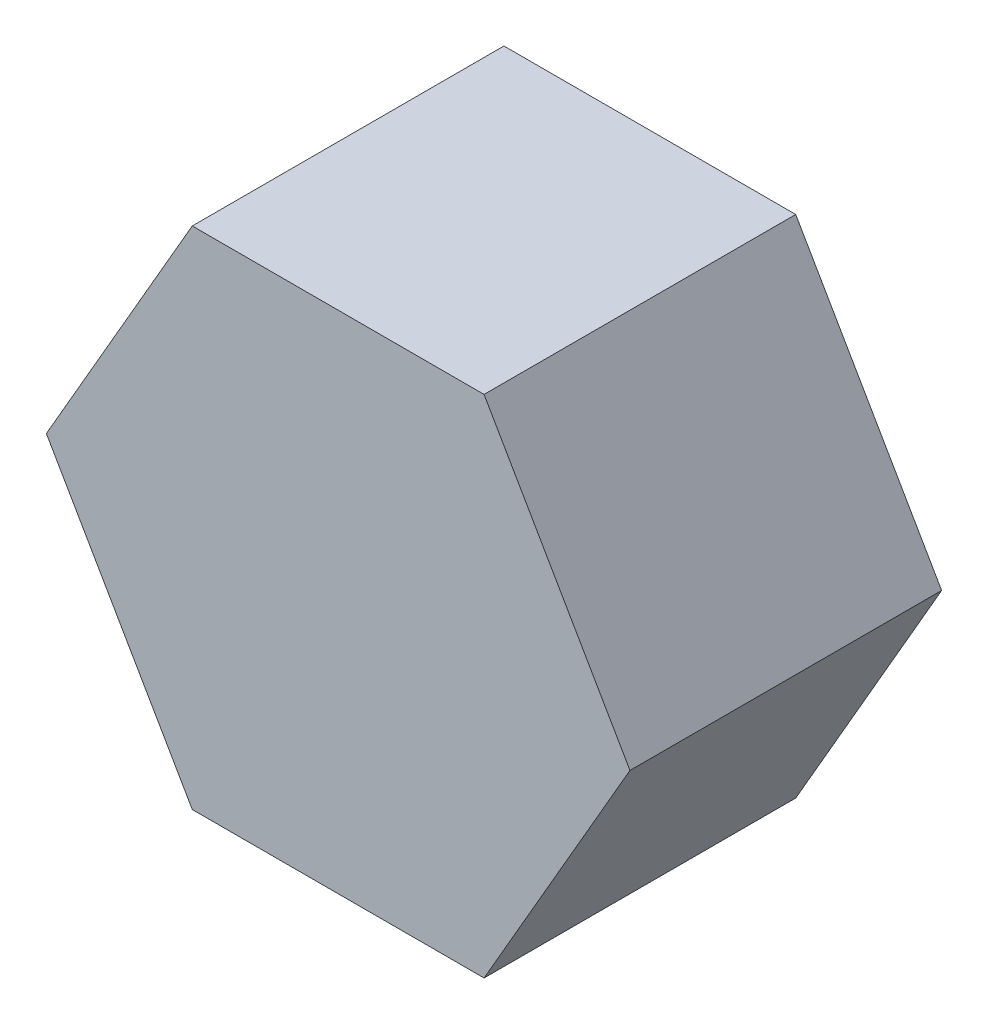
ISO-10303-21;
HEADER;
FILE_DESCRIPTION(('STEP AP214'),'2;1');
FILE_NAME('part.step','',(''),(''),'','','');
FILE_SCHEMA(('AUTOMOTIVE_DESIGN { 1 0 10303 214 1 1 1 1 }'));
ENDSEC;
DATA;
#1=APPLICATION_CONTEXT('core data for automotive mechanical design processes');
#2=APPLICATION_PROTOCOL_DEFINITION('international standard','automotive_design',2000,#1);
#3=PRODUCT_CONTEXT('',#1,'mechanical');
#4=PRODUCT('Part','Part','',(#3));
#5=PRODUCT_RELATED_PRODUCT_CATEGORY('part','',(#4));
#6=PRODUCT_DEFINITION_FORMATION('','',#4);
#7=PRODUCT_DEFINITION_CONTEXT('part definition',#1,'design');
#8=PRODUCT_DEFINITION('design','',#6,#7);
#9=PRODUCT_DEFINITION_SHAPE('','',#8);
#10=(LENGTH_UNIT() NAMED_UNIT(*) SI_UNIT(.MILLI.,.METRE.));
#11=(NAMED_UNIT(*) PLANE_ANGLE_UNIT() SI_UNIT($,.RADIAN.));
#12=(NAMED_UNIT(*) SI_UNIT($,.STERADIAN.) SOLID_ANGLE_UNIT());
#13=UNCERTAINTY_MEASURE_WITH_UNIT(LENGTH_MEASURE(1.E-05),#10,'distance_accuracy_value','');
#14=(GEOMETRIC_REPRESENTATION_CONTEXT(3) GLOBAL_UNCERTAINTY_ASSIGNED_CONTEXT((#13)) GLOBAL_UNIT_ASSIGNED_CONTEXT((#10,
#11,#12)) REPRESENTATION_CONTEXT('',''));
#15=CARTESIAN_POINT('',(0.,0.,0.));
#16=DIRECTION('',(0.,0.,1.));
#17=DIRECTION('',(1.,0.,0.));
#18=AXIS2_PLACEMENT_3D('',#15,#16,#17);
#19=CARTESIAN_POINT('',(6.92800000000014,-11.9996479948371,14.8));
#20=DIRECTION('',(-0.866025403784441,0.499999999999995,0.));
#21=DIRECTION('',(-0.499999999999995,-0.866025403784442,0.));
#22=AXIS2_PLACEMENT_3D('',#19,#20,#21);
#23=PLANE('',#22);
#24=DIRECTION('',(0.499999999999995,0.866025403784441,0.));
#25=VECTOR('',#24,1.);
#26=CARTESIAN_POINT('',(6.92800000000014,-11.9996479948371,0.));
#27=LINE('',#26,#25);
#28=CARTESIAN_POINT('',(6.92800000000014,-11.9996479948371,0.));
#29=VERTEX_POINT('',#28);
#30=CARTESIAN_POINT('',(13.856,0.,0.));
#31=VERTEX_POINT('',#30);
#32=EDGE_CURVE('E130',#29,#31,#27,.T.);
#33=ORIENTED_EDGE('',*,*,#32,.T.);
#34=DIRECTION('',(0.,0.,-1.));
#35=VECTOR('',#34,1.);
#36=CARTESIAN_POINT('',(13.856,0.,14.8));
#37=LINE('',#36,#35);
#38=CARTESIAN_POINT('',(13.856,0.,14.8));
#39=VERTEX_POINT('',#38);
#40=EDGE_CURVE('E11',#39,#31,#37,.T.);
#41=ORIENTED_EDGE('',*,*,#40,.F.);
#42=DIRECTION('',(0.499999999999995,0.866025403784441,0.));
#43=VECTOR('',#42,1.);
#44=CARTESIAN_POINT('',(6.92800000000014,-11.9996479948371,14.8));
#45=LINE('',#44,#43);
#46=CARTESIAN_POINT('',(6.92800000000014,-11.9996479948371,14.8));
#47=VERTEX_POINT('',#46);
#48=EDGE_CURVE('E140',#47,#39,#45,.T.);
#49=ORIENTED_EDGE('',*,*,#48,.F.);
#50=DIRECTION('',(0.,0.,-1.));
#51=VECTOR('',#50,1.);
#52=CARTESIAN_POINT('',(6.92800000000014,-11.9996479948371,14.8));
#53=LINE('',#52,#51);
#54=EDGE_CURVE('E124',#47,#29,#53,.T.);
#55=ORIENTED_EDGE('',*,*,#54,.T.);
#56=EDGE_LOOP('',(#33,#41,#49,#55));
#57=FACE_BOUND('',#56,.T.);
#58=ADVANCED_FACE('F43',(#57),#23,.F.);
#59=CARTESIAN_POINT('',(13.856,0.,14.8));
#60=DIRECTION('',(-0.866025403784438,-0.500000000000001,0.));
#61=DIRECTION('',(0.500000000000001,-0.866025403784438,0.));
#62=AXIS2_PLACEMENT_3D('',#59,#60,#61);
#63=PLANE('',#62);
#64=DIRECTION('',(-0.500000000000001,0.866025403784438,0.));
#65=VECTOR('',#64,1.);
#66=CARTESIAN_POINT('',(13.856,0.,0.));
#67=LINE('',#66,#65);
#68=CARTESIAN_POINT('',(6.92799999999997,11.9996479948372,0.));
#69=VERTEX_POINT('',#68);
#70=EDGE_CURVE('E128',#31,#69,#67,.T.);
#71=ORIENTED_EDGE('',*,*,#70,.T.);
#72=DIRECTION('',(0.,0.,-1.));
#73=VECTOR('',#72,1.);
#74=CARTESIAN_POINT('',(6.92799999999997,11.9996479948372,14.8));
#75=LINE('',#74,#73);
#76=CARTESIAN_POINT('',(6.92799999999997,11.9996479948372,14.8));
#77=VERTEX_POINT('',#76);
#78=EDGE_CURVE('E51',#77,#69,#75,.T.);
#79=ORIENTED_EDGE('',*,*,#78,.F.);
#80=DIRECTION('',(-0.500000000000001,0.866025403784438,0.));
#81=VECTOR('',#80,1.);
#82=CARTESIAN_POINT('',(13.856,0.,14.8));
#83=LINE('',#82,#81);
#84=EDGE_CURVE('E96',#39,#77,#83,.T.);
#85=ORIENTED_EDGE('',*,*,#84,.F.);
#86=ORIENTED_EDGE('',*,*,#40,.T.);
#87=EDGE_LOOP('',(#71,#79,#85,#86));
#88=FACE_BOUND('',#87,.T.);
#89=ADVANCED_FACE('F161',(#88),#63,.F.);
#90=CARTESIAN_POINT('',(6.92799999999997,11.9996479948372,14.8));
#91=DIRECTION('',(0.,-1.,0.));
#92=DIRECTION('',(1.,0.,0.));
#93=AXIS2_PLACEMENT_3D('',#90,#91,#92);
#94=PLANE('',#93);
#95=DIRECTION('',(-1.,0.,0.));
#96=VECTOR('',#95,1.);
#97=CARTESIAN_POINT('',(6.92799999999997,11.9996479948372,0.));
#98=LINE('',#97,#96);
#99=CARTESIAN_POINT('',(-6.92800000000005,11.9996479948372,0.));
#100=VERTEX_POINT('',#99);
#101=EDGE_CURVE('E134',#69,#100,#98,.T.);
#102=ORIENTED_EDGE('',*,*,#101,.T.);
#103=DIRECTION('',(0.,0.,-1.));
#104=VECTOR('',#103,1.);
#105=CARTESIAN_POINT('',(-6.92800000000005,11.9996479948372,14.8));
#106=LINE('',#105,#104);
#107=CARTESIAN_POINT('',(-6.92800000000005,11.9996479948372,14.8));
#108=VERTEX_POINT('',#107);
#109=EDGE_CURVE('E117',#108,#100,#106,.T.);
#110=ORIENTED_EDGE('',*,*,#109,.F.);
#111=DIRECTION('',(-1.,0.,0.));
#112=VECTOR('',#111,1.);
#113=CARTESIAN_POINT('',(6.92799999999997,11.9996479948372,14.8));
#114=LINE('',#113,#112);
#115=EDGE_CURVE('E108',#77,#108,#114,.T.);
#116=ORIENTED_EDGE('',*,*,#115,.F.);
#117=ORIENTED_EDGE('',*,*,#78,.T.);
#118=EDGE_LOOP('',(#102,#110,#116,#117));
#119=FACE_BOUND('',#118,.T.);
#120=ADVANCED_FACE('F141',(#119),#94,.F.);
#121=CARTESIAN_POINT('',(-6.92800000000005,11.9996479948372,14.8));
#122=DIRECTION('',(0.866025403784442,-0.499999999999995,0.));
#123=DIRECTION('',(0.499999999999995,0.866025403784441,0.));
#124=AXIS2_PLACEMENT_3D('',#121,#122,#123);
#125=PLANE('',#124);
#126=DIRECTION('',(-0.499999999999995,-0.866025403784441,0.));
#127=VECTOR('',#126,1.);
#128=CARTESIAN_POINT('',(-6.92800000000005,11.9996479948372,0.));
#129=LINE('',#128,#127);
#130=CARTESIAN_POINT('',(-13.856,0.,0.));
#131=VERTEX_POINT('',#130);
#132=EDGE_CURVE('E119',#100,#131,#129,.T.);
#133=ORIENTED_EDGE('',*,*,#132,.T.);
#134=DIRECTION('',(0.,0.,-1.));
#135=VECTOR('',#134,1.);
#136=CARTESIAN_POINT('',(-13.856,0.,14.8));
#137=LINE('',#136,#135);
#138=CARTESIAN_POINT('',(-13.856,0.,14.8));
#139=VERTEX_POINT('',#138);
#140=EDGE_CURVE('E111',#139,#131,#137,.T.);
#141=ORIENTED_EDGE('',*,*,#140,.F.);
#142=DIRECTION('',(-0.499999999999995,-0.866025403784441,0.));
#143=VECTOR('',#142,1.);
#144=CARTESIAN_POINT('',(-6.92800000000005,11.9996479948372,14.8));
#145=LINE('',#144,#143);
#146=EDGE_CURVE('E103',#108,#139,#145,.T.);
#147=ORIENTED_EDGE('',*,*,#146,.F.);
#148=ORIENTED_EDGE('',*,*,#109,.T.);
#149=EDGE_LOOP('',(#133,#141,#147,#148));
#150=FACE_BOUND('',#149,.T.);
#151=ADVANCED_FACE('F113',(#150),#125,.F.);
#152=CARTESIAN_POINT('',(-13.856,0.,14.8));
#153=DIRECTION('',(0.866025403784435,0.500000000000007,0.));
#154=DIRECTION('',(-0.500000000000007,0.866025403784435,0.));
#155=AXIS2_PLACEMENT_3D('',#152,#153,#154);
#156=PLANE('',#155);
#157=DIRECTION('',(0.500000000000007,-0.866025403784435,0.));
#158=VECTOR('',#157,1.);
#159=CARTESIAN_POINT('',(-13.856,0.,0.));
#160=LINE('',#159,#158);
#161=CARTESIAN_POINT('',(-6.92799999999989,-11.9996479948372,0.));
#162=VERTEX_POINT('',#161);
#163=EDGE_CURVE('E85',#131,#162,#160,.T.);
#164=ORIENTED_EDGE('',*,*,#163,.T.);
#165=DIRECTION('',(0.,0.,-1.));
#166=VECTOR('',#165,1.);
#167=CARTESIAN_POINT('',(-6.92799999999989,-11.9996479948372,14.8));
#168=LINE('',#167,#166);
#169=CARTESIAN_POINT('',(-6.92799999999989,-11.9996479948372,14.8));
#170=VERTEX_POINT('',#169);
#171=EDGE_CURVE('E120',#170,#162,#168,.T.);
#172=ORIENTED_EDGE('',*,*,#171,.F.);
#173=DIRECTION('',(0.500000000000007,-0.866025403784435,0.));
#174=VECTOR('',#173,1.);
#175=CARTESIAN_POINT('',(-13.856,0.,14.8));
#176=LINE('',#175,#174);
#177=EDGE_CURVE('E110',#139,#170,#176,.T.);
#178=ORIENTED_EDGE('',*,*,#177,.F.);
#179=ORIENTED_EDGE('',*,*,#140,.T.);
#180=EDGE_LOOP('',(#164,#172,#178,#179));
#181=FACE_BOUND('',#180,.T.);
#182=ADVANCED_FACE('F122',(#181),#156,.F.);
#183=CARTESIAN_POINT('',(-6.92799999999989,-11.9996479948372,14.8));
#184=DIRECTION('',(0.,1.,0.));
#185=DIRECTION('',(-1.,0.,0.));
#186=AXIS2_PLACEMENT_3D('',#183,#184,#185);
#187=PLANE('',#186);
#188=DIRECTION('',(1.,0.,0.));
#189=VECTOR('',#188,1.);
#190=CARTESIAN_POINT('',(-6.92799999999989,-11.9996479948372,0.));
#191=LINE('',#190,#189);
#192=EDGE_CURVE('E86',#162,#29,#191,.T.);
#193=ORIENTED_EDGE('',*,*,#192,.T.);
#194=ORIENTED_EDGE('',*,*,#54,.F.);
#195=DIRECTION('',(1.,0.,0.));
#196=VECTOR('',#195,1.);
#197=CARTESIAN_POINT('',(-6.92799999999989,-11.9996479948372,14.8));
#198=LINE('',#197,#196);
#199=EDGE_CURVE('E56',#170,#47,#198,.T.);
#200=ORIENTED_EDGE('',*,*,#199,.F.);
#201=ORIENTED_EDGE('',*,*,#171,.T.);
#202=EDGE_LOOP('',(#193,#194,#200,#201));
#203=FACE_BOUND('',#202,.T.);
#204=ADVANCED_FACE('F147',(#203),#187,.F.);
#205=CARTESIAN_POINT('',(0.,0.,14.8));
#206=DIRECTION('',(0.,0.,1.));
#207=DIRECTION('',(1.,0.,0.));
#208=AXIS2_PLACEMENT_3D('',#205,#206,#207);
#209=PLANE('',#208);
#210=ORIENTED_EDGE('',*,*,#48,.T.);
#211=ORIENTED_EDGE('',*,*,#84,.T.);
#212=ORIENTED_EDGE('',*,*,#115,.T.);
#213=ORIENTED_EDGE('',*,*,#146,.T.);
#214=ORIENTED_EDGE('',*,*,#177,.T.);
#215=ORIENTED_EDGE('',*,*,#199,.T.);
#216=EDGE_LOOP('',(#210,#211,#212,#213,#214,#215));
#217=FACE_BOUND('',#216,.T.);
#218=ADVANCED_FACE('F104',(#217),#209,.T.);
#219=CARTESIAN_POINT('',(0.,0.,0.));
#220=DIRECTION('',(0.,0.,1.));
#221=DIRECTION('',(1.,0.,0.));
#222=AXIS2_PLACEMENT_3D('',#219,#220,#221);
#223=PLANE('',#222);
#224=ORIENTED_EDGE('',*,*,#32,.F.);
#225=ORIENTED_EDGE('',*,*,#192,.F.);
#226=ORIENTED_EDGE('',*,*,#163,.F.);
#227=ORIENTED_EDGE('',*,*,#132,.F.);
#228=ORIENTED_EDGE('',*,*,#101,.F.);
#229=ORIENTED_EDGE('',*,*,#70,.F.);
#230=EDGE_LOOP('',(#224,#225,#226,#227,#228,#229));
#231=FACE_BOUND('',#230,.T.);
#232=ADVANCED_FACE('F148',(#231),#223,.F.);
#233=CLOSED_SHELL('',(#58,#89,#120,#151,#182,#204,#218,#232));
#234=MANIFOLD_SOLID_BREP('B2',#233);
#235=ADVANCED_BREP_SHAPE_REPRESENTATION('',(#18,#234),#14);
#236=SHAPE_DEFINITION_REPRESENTATION(#9,#235);
ENDSEC;
END-ISO-10303-21;
